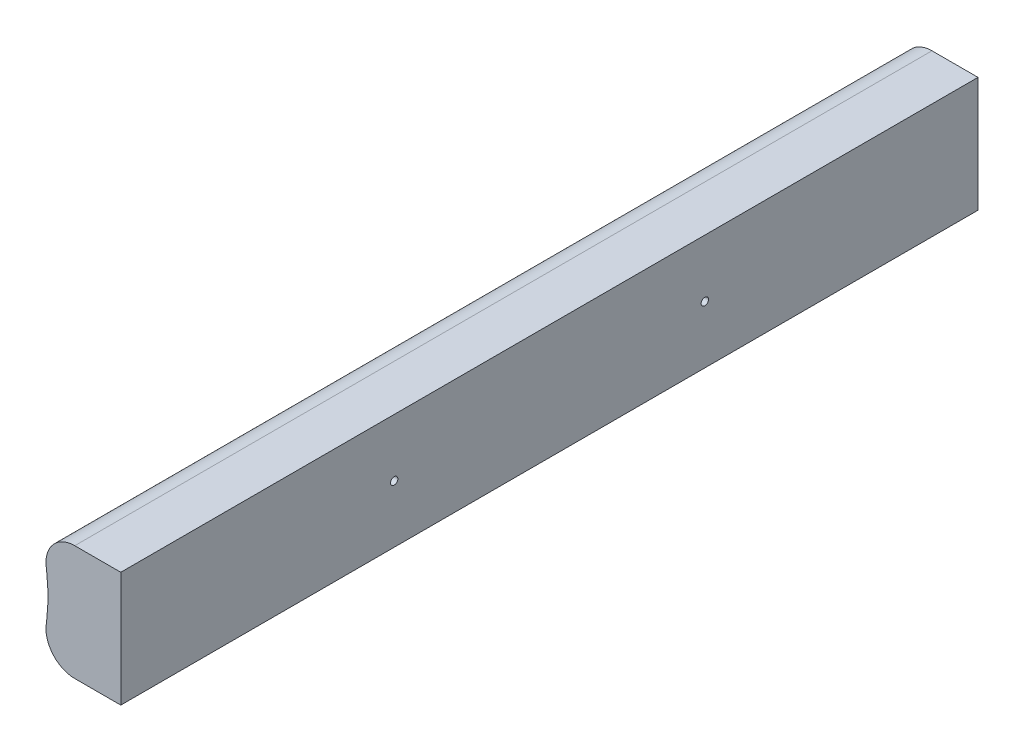
ISO-10303-21;
HEADER;
FILE_DESCRIPTION(('STEP AP214'),'2;1');
FILE_NAME('part.step','',(''),(''),'','','');
FILE_SCHEMA(('AUTOMOTIVE_DESIGN { 1 0 10303 214 1 1 1 1 }'));
ENDSEC;
DATA;
#1=APPLICATION_CONTEXT('core data for automotive mechanical design processes');
#2=APPLICATION_PROTOCOL_DEFINITION('international standard','automotive_design',2000,#1);
#3=PRODUCT_CONTEXT('',#1,'mechanical');
#4=PRODUCT('Part','Part','',(#3));
#5=PRODUCT_RELATED_PRODUCT_CATEGORY('part','',(#4));
#6=PRODUCT_DEFINITION_FORMATION('','',#4);
#7=PRODUCT_DEFINITION_CONTEXT('part definition',#1,'design');
#8=PRODUCT_DEFINITION('design','',#6,#7);
#9=PRODUCT_DEFINITION_SHAPE('','',#8);
#10=(LENGTH_UNIT() NAMED_UNIT(*) SI_UNIT(.MILLI.,.METRE.));
#11=(NAMED_UNIT(*) PLANE_ANGLE_UNIT() SI_UNIT($,.RADIAN.));
#12=(NAMED_UNIT(*) SI_UNIT($,.STERADIAN.) SOLID_ANGLE_UNIT());
#13=UNCERTAINTY_MEASURE_WITH_UNIT(LENGTH_MEASURE(1.E-05),#10,'distance_accuracy_value','');
#14=(GEOMETRIC_REPRESENTATION_CONTEXT(3) GLOBAL_UNCERTAINTY_ASSIGNED_CONTEXT((#13)) GLOBAL_UNIT_ASSIGNED_CONTEXT((#10,
#11,#12)) REPRESENTATION_CONTEXT('',''));
#15=CARTESIAN_POINT('',(0.,0.,0.));
#16=DIRECTION('',(0.,0.,1.));
#17=DIRECTION('',(1.,0.,0.));
#18=AXIS2_PLACEMENT_3D('',#15,#16,#17);
#19=CARTESIAN_POINT('',(-267.031514756728,0.,473.075));
#20=DIRECTION('',(0.,0.,-1.));
#21=DIRECTION('',(-1.,0.,0.));
#22=AXIS2_PLACEMENT_3D('',#19,#20,#21);
#23=CYLINDRICAL_SURFACE('',#22,186.630214138621);
#24=CARTESIAN_POINT('',(-267.031514756728,0.,-473.075));
#25=DIRECTION('',(0.,0.,-1.));
#26=DIRECTION('',(1.,0.,0.));
#27=AXIS2_PLACEMENT_3D('',#24,#25,#26);
#28=CIRCLE('',#27,186.630214138621);
#29=CARTESIAN_POINT('',(-81.4560069204938,19.8133218000225,-473.075));
#30=VERTEX_POINT('',#29);
#31=CARTESIAN_POINT('',(-81.4560069204938,-19.8133218000225,-473.075));
#32=VERTEX_POINT('',#31);
#33=EDGE_CURVE('E135',#30,#32,#28,.T.);
#34=ORIENTED_EDGE('',*,*,#33,.T.);
#35=DIRECTION('',(0.,0.,-1.));
#36=VECTOR('',#35,1.);
#37=CARTESIAN_POINT('',(-81.4560069204938,-19.8133218000225,473.075));
#38=LINE('',#37,#36);
#39=CARTESIAN_POINT('',(-81.4560069204938,-19.8133218000225,473.075));
#40=VERTEX_POINT('',#39);
#41=EDGE_CURVE('E11',#40,#32,#38,.T.);
#42=ORIENTED_EDGE('',*,*,#41,.F.);
#43=CARTESIAN_POINT('',(-267.031514756728,0.,473.075));
#44=DIRECTION('',(0.,0.,-1.));
#45=DIRECTION('',(1.,0.,0.));
#46=AXIS2_PLACEMENT_3D('',#43,#44,#45);
#47=CIRCLE('',#46,186.630214138621);
#48=CARTESIAN_POINT('',(-81.4560069204938,19.8133218000225,473.075));
#49=VERTEX_POINT('',#48);
#50=EDGE_CURVE('E150',#49,#40,#47,.T.);
#51=ORIENTED_EDGE('',*,*,#50,.F.);
#52=DIRECTION('',(0.,0.,-1.));
#53=VECTOR('',#52,1.);
#54=CARTESIAN_POINT('',(-81.4560069204938,19.8133218000225,473.075));
#55=LINE('',#54,#53);
#56=EDGE_CURVE('E131',#49,#30,#55,.T.);
#57=ORIENTED_EDGE('',*,*,#56,.T.);
#58=EDGE_LOOP('',(#34,#42,#51,#57));
#59=FACE_BOUND('',#58,.T.);
#60=ADVANCED_FACE('F36',(#59),#23,.F.);
#61=CARTESIAN_POINT('',(-81.4560069204938,-19.8133218000225,473.075));
#62=DIRECTION('',(0.994348684068897,-0.106163527119499,0.));
#63=DIRECTION('',(0.106163527119499,0.994348684068897,0.));
#64=AXIS2_PLACEMENT_3D('',#61,#62,#63);
#65=PLANE('',#64);
#66=DIRECTION('',(-0.106163527119499,-0.994348684068897,0.));
#67=VECTOR('',#66,1.);
#68=CARTESIAN_POINT('',(-81.4560069204938,-19.8133218000225,-473.075));
#69=LINE('',#68,#67);
#70=CARTESIAN_POINT('',(-82.3705707191875,-28.3793080139561,-473.075));
#71=VERTEX_POINT('',#70);
#72=EDGE_CURVE('E138',#32,#71,#69,.T.);
#73=ORIENTED_EDGE('',*,*,#72,.T.);
#74=DIRECTION('',(0.,0.,-1.));
#75=VECTOR('',#74,1.);
#76=CARTESIAN_POINT('',(-82.3705707191875,-28.3793080139561,473.075));
#77=LINE('',#76,#75);
#78=CARTESIAN_POINT('',(-82.3705707191875,-28.3793080139561,473.075));
#79=VERTEX_POINT('',#78);
#80=EDGE_CURVE('E44',#79,#71,#77,.T.);
#81=ORIENTED_EDGE('',*,*,#80,.F.);
#82=DIRECTION('',(-0.106163527119499,-0.994348684068897,0.));
#83=VECTOR('',#82,1.);
#84=CARTESIAN_POINT('',(-81.4560069204938,-19.8133218000225,473.075));
#85=LINE('',#84,#83);
#86=EDGE_CURVE('E96',#40,#79,#85,.T.);
#87=ORIENTED_EDGE('',*,*,#86,.F.);
#88=ORIENTED_EDGE('',*,*,#41,.T.);
#89=EDGE_LOOP('',(#73,#81,#87,#88));
#90=FACE_BOUND('',#89,.T.);
#91=ADVANCED_FACE('F218',(#90),#65,.F.);
#92=CARTESIAN_POINT('',(-50.8,-31.75,473.075));
#93=DIRECTION('',(0.,0.,-1.));
#94=DIRECTION('',(-1.,0.,0.));
#95=AXIS2_PLACEMENT_3D('',#92,#93,#94);
#96=CYLINDRICAL_SURFACE('',#95,31.75);
#97=CARTESIAN_POINT('',(-50.8,-31.75,-473.075));
#98=DIRECTION('',(0.,0.,1.));
#99=DIRECTION('',(1.,0.,0.));
#100=AXIS2_PLACEMENT_3D('',#97,#98,#99);
#101=CIRCLE('',#100,31.75);
#102=CARTESIAN_POINT('',(-50.8,-63.5,-473.075));
#103=VERTEX_POINT('',#102);
#104=EDGE_CURVE('E141',#71,#103,#101,.T.);
#105=ORIENTED_EDGE('',*,*,#104,.T.);
#106=DIRECTION('',(0.,0.,-1.));
#107=VECTOR('',#106,1.);
#108=CARTESIAN_POINT('',(-50.8,-63.5,473.075));
#109=LINE('',#108,#107);
#110=CARTESIAN_POINT('',(-50.8,-63.5,473.075));
#111=VERTEX_POINT('',#110);
#112=EDGE_CURVE('E157',#111,#103,#109,.T.);
#113=ORIENTED_EDGE('',*,*,#112,.F.);
#114=CARTESIAN_POINT('',(-50.8,-31.75,473.075));
#115=DIRECTION('',(0.,0.,1.));
#116=DIRECTION('',(1.,0.,0.));
#117=AXIS2_PLACEMENT_3D('',#114,#115,#116);
#118=CIRCLE('',#117,31.75);
#119=EDGE_CURVE('E165',#79,#111,#118,.T.);
#120=ORIENTED_EDGE('',*,*,#119,.F.);
#121=ORIENTED_EDGE('',*,*,#80,.T.);
#122=EDGE_LOOP('',(#105,#113,#120,#121));
#123=FACE_BOUND('',#122,.T.);
#124=ADVANCED_FACE('F163',(#123),#96,.T.);
#125=CARTESIAN_POINT('',(-50.8,-63.5,473.075));
#126=DIRECTION('',(0.,1.,0.));
#127=DIRECTION('',(-1.,0.,0.));
#128=AXIS2_PLACEMENT_3D('',#125,#126,#127);
#129=PLANE('',#128);
#130=DIRECTION('',(1.,0.,0.));
#131=VECTOR('',#130,1.);
#132=CARTESIAN_POINT('',(-50.8,-63.5,-473.075));
#133=LINE('',#132,#131);
#134=CARTESIAN_POINT('',(0.,-63.5,-473.075));
#135=VERTEX_POINT('',#134);
#136=EDGE_CURVE('E143',#103,#135,#133,.T.);
#137=ORIENTED_EDGE('',*,*,#136,.T.);
#138=DIRECTION('',(0.,0.,-1.));
#139=VECTOR('',#138,1.);
#140=CARTESIAN_POINT('',(0.,-63.5,473.075));
#141=LINE('',#140,#139);
#142=CARTESIAN_POINT('',(0.,-63.5,473.075));
#143=VERTEX_POINT('',#142);
#144=EDGE_CURVE('E154',#143,#135,#141,.T.);
#145=ORIENTED_EDGE('',*,*,#144,.F.);
#146=DIRECTION('',(1.,0.,0.));
#147=VECTOR('',#146,1.);
#148=CARTESIAN_POINT('',(-50.8,-63.5,473.075));
#149=LINE('',#148,#147);
#150=EDGE_CURVE('E177',#111,#143,#149,.T.);
#151=ORIENTED_EDGE('',*,*,#150,.F.);
#152=ORIENTED_EDGE('',*,*,#112,.T.);
#153=EDGE_LOOP('',(#137,#145,#151,#152));
#154=FACE_BOUND('',#153,.T.);
#155=ADVANCED_FACE('F173',(#154),#129,.F.);
#156=CARTESIAN_POINT('',(0.,-63.5,473.075));
#157=DIRECTION('',(-1.,0.,0.));
#158=DIRECTION('',(0.,-1.,0.));
#159=AXIS2_PLACEMENT_3D('',#156,#157,#158);
#160=PLANE('',#159);
#161=CARTESIAN_POINT('',(0.,0.,171.323));
#162=DIRECTION('',(1.,0.,0.));
#163=DIRECTION('',(0.,0.,-1.));
#164=AXIS2_PLACEMENT_3D('',#161,#162,#163);
#165=CIRCLE('',#164,4.064);
#166=CARTESIAN_POINT('',(0.,0.,167.259));
#167=VERTEX_POINT('',#166);
#168=EDGE_CURVE('E191',#167,#167,#165,.T.);
#169=ORIENTED_EDGE('',*,*,#168,.F.);
#170=EDGE_LOOP('',(#169));
#171=FACE_BOUND('',#170,.T.);
#172=CARTESIAN_POINT('',(0.,0.,-171.577));
#173=DIRECTION('',(1.,0.,0.));
#174=DIRECTION('',(0.,0.,-1.));
#175=AXIS2_PLACEMENT_3D('',#172,#173,#174);
#176=CIRCLE('',#175,4.064);
#177=CARTESIAN_POINT('',(0.,0.,-175.641));
#178=VERTEX_POINT('',#177);
#179=EDGE_CURVE('E185',#178,#178,#176,.T.);
#180=ORIENTED_EDGE('',*,*,#179,.F.);
#181=EDGE_LOOP('',(#180));
#182=FACE_BOUND('',#181,.T.);
#183=DIRECTION('',(0.,1.,0.));
#184=VECTOR('',#183,1.);
#185=CARTESIAN_POINT('',(0.,-63.5,-473.075));
#186=LINE('',#185,#184);
#187=CARTESIAN_POINT('',(0.,63.5,-473.075));
#188=VERTEX_POINT('',#187);
#189=EDGE_CURVE('E145',#135,#188,#186,.T.);
#190=ORIENTED_EDGE('',*,*,#189,.T.);
#191=DIRECTION('',(0.,0.,-1.));
#192=VECTOR('',#191,1.);
#193=CARTESIAN_POINT('',(0.,63.5,473.075));
#194=LINE('',#193,#192);
#195=CARTESIAN_POINT('',(0.,63.5,473.075));
#196=VERTEX_POINT('',#195);
#197=EDGE_CURVE('E126',#196,#188,#194,.T.);
#198=ORIENTED_EDGE('',*,*,#197,.F.);
#199=DIRECTION('',(0.,1.,0.));
#200=VECTOR('',#199,1.);
#201=CARTESIAN_POINT('',(0.,-63.5,473.075));
#202=LINE('',#201,#200);
#203=EDGE_CURVE('E117',#143,#196,#202,.T.);
#204=ORIENTED_EDGE('',*,*,#203,.F.);
#205=ORIENTED_EDGE('',*,*,#144,.T.);
#206=EDGE_LOOP('',(#190,#198,#204,#205));
#207=FACE_BOUND('',#206,.T.);
#208=ADVANCED_FACE('F176',(#171,#182,#207),#160,.F.);
#209=CARTESIAN_POINT('',(0.,63.5,473.075));
#210=DIRECTION('',(0.,-1.,0.));
#211=DIRECTION('',(1.,0.,0.));
#212=AXIS2_PLACEMENT_3D('',#209,#210,#211);
#213=PLANE('',#212);
#214=DIRECTION('',(-1.,0.,0.));
#215=VECTOR('',#214,1.);
#216=CARTESIAN_POINT('',(0.,63.5,-473.075));
#217=LINE('',#216,#215);
#218=CARTESIAN_POINT('',(-50.8,63.5,-473.075));
#219=VERTEX_POINT('',#218);
#220=EDGE_CURVE('E125',#188,#219,#217,.T.);
#221=ORIENTED_EDGE('',*,*,#220,.T.);
#222=DIRECTION('',(0.,0.,-1.));
#223=VECTOR('',#222,1.);
#224=CARTESIAN_POINT('',(-50.8,63.5,473.075));
#225=LINE('',#224,#223);
#226=CARTESIAN_POINT('',(-50.8,63.5,473.075));
#227=VERTEX_POINT('',#226);
#228=EDGE_CURVE('E122',#227,#219,#225,.T.);
#229=ORIENTED_EDGE('',*,*,#228,.F.);
#230=DIRECTION('',(-1.,0.,0.));
#231=VECTOR('',#230,1.);
#232=CARTESIAN_POINT('',(0.,63.5,473.075));
#233=LINE('',#232,#231);
#234=EDGE_CURVE('E111',#196,#227,#233,.T.);
#235=ORIENTED_EDGE('',*,*,#234,.F.);
#236=ORIENTED_EDGE('',*,*,#197,.T.);
#237=EDGE_LOOP('',(#221,#229,#235,#236));
#238=FACE_BOUND('',#237,.T.);
#239=ADVANCED_FACE('F123',(#238),#213,.F.);
#240=CARTESIAN_POINT('',(-50.8,31.75,473.075));
#241=DIRECTION('',(0.,0.,-1.));
#242=DIRECTION('',(-1.,0.,0.));
#243=AXIS2_PLACEMENT_3D('',#240,#241,#242);
#244=CYLINDRICAL_SURFACE('',#243,31.75);
#245=CARTESIAN_POINT('',(-50.8,31.75,-473.075));
#246=DIRECTION('',(0.,0.,1.));
#247=DIRECTION('',(1.,0.,0.));
#248=AXIS2_PLACEMENT_3D('',#245,#246,#247);
#249=CIRCLE('',#248,31.75);
#250=CARTESIAN_POINT('',(-82.3705707191875,28.379308013956,-473.075));
#251=VERTEX_POINT('',#250);
#252=EDGE_CURVE('E82',#219,#251,#249,.T.);
#253=ORIENTED_EDGE('',*,*,#252,.T.);
#254=DIRECTION('',(0.,0.,-1.));
#255=VECTOR('',#254,1.);
#256=CARTESIAN_POINT('',(-82.3705707191875,28.379308013956,473.075));
#257=LINE('',#256,#255);
#258=CARTESIAN_POINT('',(-82.3705707191875,28.379308013956,473.075));
#259=VERTEX_POINT('',#258);
#260=EDGE_CURVE('E127',#259,#251,#257,.T.);
#261=ORIENTED_EDGE('',*,*,#260,.F.);
#262=CARTESIAN_POINT('',(-50.8,31.75,473.075));
#263=DIRECTION('',(0.,0.,1.));
#264=DIRECTION('',(1.,0.,0.));
#265=AXIS2_PLACEMENT_3D('',#262,#263,#264);
#266=CIRCLE('',#265,31.75);
#267=EDGE_CURVE('E115',#227,#259,#266,.T.);
#268=ORIENTED_EDGE('',*,*,#267,.F.);
#269=ORIENTED_EDGE('',*,*,#228,.T.);
#270=EDGE_LOOP('',(#253,#261,#268,#269));
#271=FACE_BOUND('',#270,.T.);
#272=ADVANCED_FACE('F129',(#271),#244,.T.);
#273=CARTESIAN_POINT('',(-82.3705707191875,28.379308013956,473.075));
#274=DIRECTION('',(0.994348684068897,0.106163527119499,0.));
#275=DIRECTION('',(-0.106163527119499,0.994348684068897,0.));
#276=AXIS2_PLACEMENT_3D('',#273,#274,#275);
#277=PLANE('',#276);
#278=DIRECTION('',(0.106163527119499,-0.994348684068897,0.));
#279=VECTOR('',#278,1.);
#280=CARTESIAN_POINT('',(-82.3705707191875,28.379308013956,-473.075));
#281=LINE('',#280,#279);
#282=EDGE_CURVE('E88',#251,#30,#281,.T.);
#283=ORIENTED_EDGE('',*,*,#282,.T.);
#284=ORIENTED_EDGE('',*,*,#56,.F.);
#285=DIRECTION('',(0.106163527119499,-0.994348684068897,0.));
#286=VECTOR('',#285,1.);
#287=CARTESIAN_POINT('',(-82.3705707191875,28.379308013956,473.075));
#288=LINE('',#287,#286);
#289=EDGE_CURVE('E52',#259,#49,#288,.T.);
#290=ORIENTED_EDGE('',*,*,#289,.F.);
#291=ORIENTED_EDGE('',*,*,#260,.T.);
#292=EDGE_LOOP('',(#283,#284,#290,#291));
#293=FACE_BOUND('',#292,.T.);
#294=ADVANCED_FACE('F225',(#293),#277,.F.);
#295=CARTESIAN_POINT('',(-267.031514756728,0.,473.075));
#296=DIRECTION('',(0.,0.,1.));
#297=DIRECTION('',(1.,0.,0.));
#298=AXIS2_PLACEMENT_3D('',#295,#296,#297);
#299=PLANE('',#298);
#300=ORIENTED_EDGE('',*,*,#50,.T.);
#301=ORIENTED_EDGE('',*,*,#86,.T.);
#302=ORIENTED_EDGE('',*,*,#119,.T.);
#303=ORIENTED_EDGE('',*,*,#150,.T.);
#304=ORIENTED_EDGE('',*,*,#203,.T.);
#305=ORIENTED_EDGE('',*,*,#234,.T.);
#306=ORIENTED_EDGE('',*,*,#267,.T.);
#307=ORIENTED_EDGE('',*,*,#289,.T.);
#308=EDGE_LOOP('',(#300,#301,#302,#303,#304,#305,#306,#307));
#309=FACE_BOUND('',#308,.T.);
#310=ADVANCED_FACE('F113',(#309),#299,.T.);
#311=CARTESIAN_POINT('',(-267.031514756728,0.,-473.075));
#312=DIRECTION('',(0.,0.,1.));
#313=DIRECTION('',(1.,0.,0.));
#314=AXIS2_PLACEMENT_3D('',#311,#312,#313);
#315=PLANE('',#314);
#316=ORIENTED_EDGE('',*,*,#33,.F.);
#317=ORIENTED_EDGE('',*,*,#282,.F.);
#318=ORIENTED_EDGE('',*,*,#252,.F.);
#319=ORIENTED_EDGE('',*,*,#220,.F.);
#320=ORIENTED_EDGE('',*,*,#189,.F.);
#321=ORIENTED_EDGE('',*,*,#136,.F.);
#322=ORIENTED_EDGE('',*,*,#104,.F.);
#323=ORIENTED_EDGE('',*,*,#72,.F.);
#324=EDGE_LOOP('',(#316,#317,#318,#319,#320,#321,#322,#323));
#325=FACE_BOUND('',#324,.T.);
#326=ADVANCED_FACE('F169',(#325),#315,.F.);
#327=CARTESIAN_POINT('',(-19.05,0.,-171.577));
#328=DIRECTION('',(1.,0.,0.));
#329=DIRECTION('',(0.,0.,-1.));
#330=AXIS2_PLACEMENT_3D('',#327,#328,#329);
#331=CONICAL_SURFACE('',#330,4.06399999999999,1.02974425867665);
#332=CARTESIAN_POINT('',(-21.491897555728,0.,-171.577));
#333=VERTEX_POINT('',#332);
#334=VERTEX_LOOP('',#333);
#335=FACE_BOUND('',#334,.T.);
#336=CARTESIAN_POINT('',(-19.05,0.,-171.577));
#337=DIRECTION('',(1.,0.,0.));
#338=DIRECTION('',(0.,0.,-1.));
#339=AXIS2_PLACEMENT_3D('',#336,#337,#338);
#340=CIRCLE('',#339,4.06399999999999);
#341=CARTESIAN_POINT('',(-19.05,0.,-175.641));
#342=VERTEX_POINT('',#341);
#343=EDGE_CURVE('E139',#342,#342,#340,.T.);
#344=ORIENTED_EDGE('',*,*,#343,.T.);
#345=EDGE_LOOP('',(#344));
#346=FACE_BOUND('',#345,.T.);
#347=ADVANCED_FACE('F205',(#335,#346),#331,.F.);
#348=CARTESIAN_POINT('',(0.,0.,-171.577));
#349=DIRECTION('',(1.,0.,0.));
#350=DIRECTION('',(0.,0.,-1.));
#351=AXIS2_PLACEMENT_3D('',#348,#349,#350);
#352=CYLINDRICAL_SURFACE('',#351,4.064);
#353=ORIENTED_EDGE('',*,*,#343,.F.);
#354=EDGE_LOOP('',(#353));
#355=FACE_BOUND('',#354,.T.);
#356=ORIENTED_EDGE('',*,*,#179,.T.);
#357=EDGE_LOOP('',(#356));
#358=FACE_BOUND('',#357,.T.);
#359=ADVANCED_FACE('F202',(#355,#358),#352,.F.);
#360=CARTESIAN_POINT('',(-19.05,0.,171.323));
#361=DIRECTION('',(1.,0.,0.));
#362=DIRECTION('',(0.,0.,-1.));
#363=AXIS2_PLACEMENT_3D('',#360,#361,#362);
#364=CONICAL_SURFACE('',#363,4.06399999999999,1.02974425867665);
#365=CARTESIAN_POINT('',(-21.491897555728,0.,171.323));
#366=VERTEX_POINT('',#365);
#367=VERTEX_LOOP('',#366);
#368=FACE_BOUND('',#367,.T.);
#369=CARTESIAN_POINT('',(-19.05,0.,171.323));
#370=DIRECTION('',(1.,0.,0.));
#371=DIRECTION('',(0.,0.,-1.));
#372=AXIS2_PLACEMENT_3D('',#369,#370,#371);
#373=CIRCLE('',#372,4.06399999999999);
#374=CARTESIAN_POINT('',(-19.05,0.,167.259));
#375=VERTEX_POINT('',#374);
#376=EDGE_CURVE('E188',#375,#375,#373,.T.);
#377=ORIENTED_EDGE('',*,*,#376,.T.);
#378=EDGE_LOOP('',(#377));
#379=FACE_BOUND('',#378,.T.);
#380=ADVANCED_FACE('F204',(#368,#379),#364,.F.);
#381=CARTESIAN_POINT('',(0.,0.,171.323));
#382=DIRECTION('',(1.,0.,0.));
#383=DIRECTION('',(0.,0.,-1.));
#384=AXIS2_PLACEMENT_3D('',#381,#382,#383);
#385=CYLINDRICAL_SURFACE('',#384,4.064);
#386=ORIENTED_EDGE('',*,*,#376,.F.);
#387=EDGE_LOOP('',(#386));
#388=FACE_BOUND('',#387,.T.);
#389=ORIENTED_EDGE('',*,*,#168,.T.);
#390=EDGE_LOOP('',(#389));
#391=FACE_BOUND('',#390,.T.);
#392=ADVANCED_FACE('F195',(#388,#391),#385,.F.);
#393=CLOSED_SHELL('',(#60,#91,#124,#155,#208,#239,#272,#294,#310,#326,#347,#359,#380,#392));
#394=MANIFOLD_SOLID_BREP('B2',#393);
#395=ADVANCED_BREP_SHAPE_REPRESENTATION('',(#18,#394),#14);
#396=SHAPE_DEFINITION_REPRESENTATION(#9,#395);
ENDSEC;
END-ISO-10303-21;
